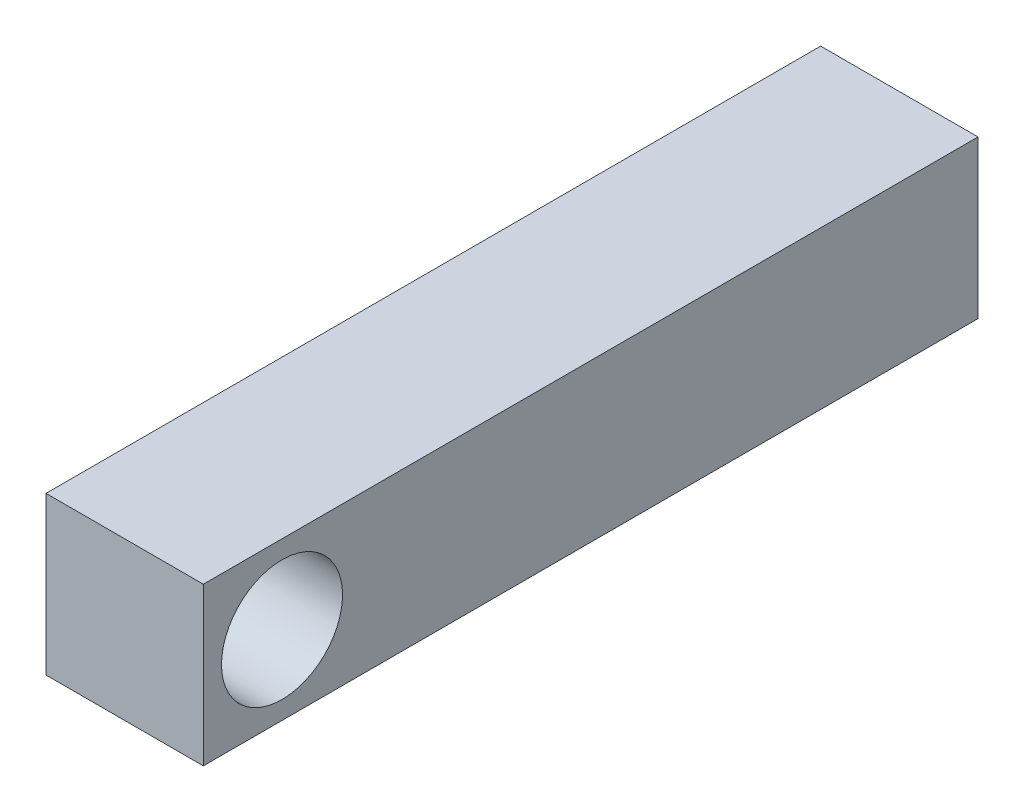
ISO-10303-21;
HEADER;
FILE_DESCRIPTION(('STEP AP214'),'2;1');
FILE_NAME('part.step','',(''),(''),'','','');
FILE_SCHEMA(('AUTOMOTIVE_DESIGN { 1 0 10303 214 1 1 1 1 }'));
ENDSEC;
DATA;
#1=APPLICATION_CONTEXT('core data for automotive mechanical design processes');
#2=APPLICATION_PROTOCOL_DEFINITION('international standard','automotive_design',2000,#1);
#3=PRODUCT_CONTEXT('',#1,'mechanical');
#4=PRODUCT('Part','Part','',(#3));
#5=PRODUCT_RELATED_PRODUCT_CATEGORY('part','',(#4));
#6=PRODUCT_DEFINITION_FORMATION('','',#4);
#7=PRODUCT_DEFINITION_CONTEXT('part definition',#1,'design');
#8=PRODUCT_DEFINITION('design','',#6,#7);
#9=PRODUCT_DEFINITION_SHAPE('','',#8);
#10=(LENGTH_UNIT() NAMED_UNIT(*) SI_UNIT(.MILLI.,.METRE.));
#11=(NAMED_UNIT(*) PLANE_ANGLE_UNIT() SI_UNIT($,.RADIAN.));
#12=(NAMED_UNIT(*) SI_UNIT($,.STERADIAN.) SOLID_ANGLE_UNIT());
#13=UNCERTAINTY_MEASURE_WITH_UNIT(LENGTH_MEASURE(1.E-05),#10,'distance_accuracy_value','');
#14=(GEOMETRIC_REPRESENTATION_CONTEXT(3) GLOBAL_UNCERTAINTY_ASSIGNED_CONTEXT((#13)) GLOBAL_UNIT_ASSIGNED_CONTEXT((#10,
#11,#12)) REPRESENTATION_CONTEXT('',''));
#15=CARTESIAN_POINT('',(0.,0.,0.));
#16=DIRECTION('',(0.,0.,1.));
#17=DIRECTION('',(1.,0.,0.));
#18=AXIS2_PLACEMENT_3D('',#15,#16,#17);
#19=CARTESIAN_POINT('',(-20.6375,-20.6375,203.2));
#20=DIRECTION('',(1.,0.,0.));
#21=DIRECTION('',(0.,0.,-1.));
#22=AXIS2_PLACEMENT_3D('',#19,#20,#21);
#23=PLANE('',#22);
#24=CARTESIAN_POINT('',(-20.6375,0.,182.5625));
#25=DIRECTION('',(-1.,0.,0.));
#26=DIRECTION('',(0.,0.,1.));
#27=AXIS2_PLACEMENT_3D('',#24,#25,#26);
#28=CIRCLE('',#27,15.875);
#29=CARTESIAN_POINT('',(-20.6375,0.,198.4375));
#30=VERTEX_POINT('',#29);
#31=EDGE_CURVE('E128',#30,#30,#28,.T.);
#32=ORIENTED_EDGE('',*,*,#31,.F.);
#33=EDGE_LOOP('',(#32));
#34=FACE_BOUND('',#33,.T.);
#35=DIRECTION('',(0.,-1.,0.));
#36=VECTOR('',#35,1.);
#37=CARTESIAN_POINT('',(-20.6375,-20.6375,0.));
#38=LINE('',#37,#36);
#39=CARTESIAN_POINT('',(-20.6375,20.6375,0.));
#40=VERTEX_POINT('',#39);
#41=CARTESIAN_POINT('',(-20.6375,-20.6375,0.));
#42=VERTEX_POINT('',#41);
#43=EDGE_CURVE('E104',#40,#42,#38,.T.);
#44=ORIENTED_EDGE('',*,*,#43,.T.);
#45=DIRECTION('',(0.,0.,-1.));
#46=VECTOR('',#45,1.);
#47=CARTESIAN_POINT('',(-20.6375,-20.6375,203.2));
#48=LINE('',#47,#46);
#49=CARTESIAN_POINT('',(-20.6375,-20.6375,203.2));
#50=VERTEX_POINT('',#49);
#51=EDGE_CURVE('E11',#50,#42,#48,.T.);
#52=ORIENTED_EDGE('',*,*,#51,.F.);
#53=DIRECTION('',(0.,-1.,0.));
#54=VECTOR('',#53,1.);
#55=CARTESIAN_POINT('',(-20.6375,-20.6375,203.2));
#56=LINE('',#55,#54);
#57=CARTESIAN_POINT('',(-20.6375,20.6375,203.2));
#58=VERTEX_POINT('',#57);
#59=EDGE_CURVE('E91',#58,#50,#56,.T.);
#60=ORIENTED_EDGE('',*,*,#59,.F.);
#61=DIRECTION('',(0.,0.,-1.));
#62=VECTOR('',#61,1.);
#63=CARTESIAN_POINT('',(-20.6375,20.6375,203.2));
#64=LINE('',#63,#62);
#65=EDGE_CURVE('E100',#58,#40,#64,.T.);
#66=ORIENTED_EDGE('',*,*,#65,.T.);
#67=EDGE_LOOP('',(#44,#52,#60,#66));
#68=FACE_BOUND('',#67,.T.);
#69=ADVANCED_FACE('F39',(#34,#68),#23,.F.);
#70=CARTESIAN_POINT('',(20.6375,-20.6375,203.2));
#71=DIRECTION('',(0.,1.,0.));
#72=DIRECTION('',(-1.,0.,0.));
#73=AXIS2_PLACEMENT_3D('',#70,#71,#72);
#74=PLANE('',#73);
#75=CARTESIAN_POINT('',(0.,-20.6375,20.6375));
#76=DIRECTION('',(0.,-1.,0.));
#77=DIRECTION('',(0.,0.,-1.));
#78=AXIS2_PLACEMENT_3D('',#75,#76,#77);
#79=CIRCLE('',#78,15.875);
#80=CARTESIAN_POINT('',(0.,-20.6375,4.7625));
#81=VERTEX_POINT('',#80);
#82=EDGE_CURVE('E120',#81,#81,#79,.T.);
#83=ORIENTED_EDGE('',*,*,#82,.F.);
#84=EDGE_LOOP('',(#83));
#85=FACE_BOUND('',#84,.T.);
#86=DIRECTION('',(1.,0.,0.));
#87=VECTOR('',#86,1.);
#88=CARTESIAN_POINT('',(20.6375,-20.6375,0.));
#89=LINE('',#88,#87);
#90=CARTESIAN_POINT('',(20.6375,-20.6375,0.));
#91=VERTEX_POINT('',#90);
#92=EDGE_CURVE('E95',#42,#91,#89,.T.);
#93=ORIENTED_EDGE('',*,*,#92,.T.);
#94=DIRECTION('',(0.,0.,-1.));
#95=VECTOR('',#94,1.);
#96=CARTESIAN_POINT('',(20.6375,-20.6375,203.2));
#97=LINE('',#96,#95);
#98=CARTESIAN_POINT('',(20.6375,-20.6375,203.2));
#99=VERTEX_POINT('',#98);
#100=EDGE_CURVE('E48',#99,#91,#97,.T.);
#101=ORIENTED_EDGE('',*,*,#100,.F.);
#102=DIRECTION('',(1.,0.,0.));
#103=VECTOR('',#102,1.);
#104=CARTESIAN_POINT('',(20.6375,-20.6375,203.2));
#105=LINE('',#104,#103);
#106=EDGE_CURVE('E86',#50,#99,#105,.T.);
#107=ORIENTED_EDGE('',*,*,#106,.F.);
#108=ORIENTED_EDGE('',*,*,#51,.T.);
#109=EDGE_LOOP('',(#93,#101,#107,#108));
#110=FACE_BOUND('',#109,.T.);
#111=ADVANCED_FACE('F94',(#85,#110),#74,.F.);
#112=CARTESIAN_POINT('',(20.6375,-20.6375,203.2));
#113=DIRECTION('',(-1.,0.,0.));
#114=DIRECTION('',(0.,0.,1.));
#115=AXIS2_PLACEMENT_3D('',#112,#113,#114);
#116=PLANE('',#115);
#117=CARTESIAN_POINT('',(20.6375,0.,182.5625));
#118=DIRECTION('',(-1.,0.,0.));
#119=DIRECTION('',(0.,0.,1.));
#120=AXIS2_PLACEMENT_3D('',#117,#118,#119);
#121=CIRCLE('',#120,15.875);
#122=CARTESIAN_POINT('',(20.6375,0.,198.4375));
#123=VERTEX_POINT('',#122);
#124=EDGE_CURVE('E124',#123,#123,#121,.T.);
#125=ORIENTED_EDGE('',*,*,#124,.T.);
#126=EDGE_LOOP('',(#125));
#127=FACE_BOUND('',#126,.T.);
#128=DIRECTION('',(0.,1.,0.));
#129=VECTOR('',#128,1.);
#130=CARTESIAN_POINT('',(20.6375,-20.6375,0.));
#131=LINE('',#130,#129);
#132=CARTESIAN_POINT('',(20.6375,20.6375,0.));
#133=VERTEX_POINT('',#132);
#134=EDGE_CURVE('E73',#91,#133,#131,.T.);
#135=ORIENTED_EDGE('',*,*,#134,.T.);
#136=DIRECTION('',(0.,0.,-1.));
#137=VECTOR('',#136,1.);
#138=CARTESIAN_POINT('',(20.6375,20.6375,203.2));
#139=LINE('',#138,#137);
#140=CARTESIAN_POINT('',(20.6375,20.6375,203.2));
#141=VERTEX_POINT('',#140);
#142=EDGE_CURVE('E97',#141,#133,#139,.T.);
#143=ORIENTED_EDGE('',*,*,#142,.F.);
#144=DIRECTION('',(0.,1.,0.));
#145=VECTOR('',#144,1.);
#146=CARTESIAN_POINT('',(20.6375,-20.6375,203.2));
#147=LINE('',#146,#145);
#148=EDGE_CURVE('E89',#99,#141,#147,.T.);
#149=ORIENTED_EDGE('',*,*,#148,.F.);
#150=ORIENTED_EDGE('',*,*,#100,.T.);
#151=EDGE_LOOP('',(#135,#143,#149,#150));
#152=FACE_BOUND('',#151,.T.);
#153=ADVANCED_FACE('F98',(#127,#152),#116,.F.);
#154=CARTESIAN_POINT('',(20.6375,20.6375,203.2));
#155=DIRECTION('',(0.,-1.,0.));
#156=DIRECTION('',(1.,0.,0.));
#157=AXIS2_PLACEMENT_3D('',#154,#155,#156);
#158=PLANE('',#157);
#159=DIRECTION('',(-1.,0.,0.));
#160=VECTOR('',#159,1.);
#161=CARTESIAN_POINT('',(20.6375,20.6375,0.));
#162=LINE('',#161,#160);
#163=EDGE_CURVE('E79',#133,#40,#162,.T.);
#164=ORIENTED_EDGE('',*,*,#163,.T.);
#165=ORIENTED_EDGE('',*,*,#65,.F.);
#166=DIRECTION('',(-1.,0.,0.));
#167=VECTOR('',#166,1.);
#168=CARTESIAN_POINT('',(20.6375,20.6375,203.2));
#169=LINE('',#168,#167);
#170=EDGE_CURVE('E56',#141,#58,#169,.T.);
#171=ORIENTED_EDGE('',*,*,#170,.F.);
#172=ORIENTED_EDGE('',*,*,#142,.T.);
#173=EDGE_LOOP('',(#164,#165,#171,#172));
#174=FACE_BOUND('',#173,.T.);
#175=ADVANCED_FACE('F114',(#174),#158,.F.);
#176=CARTESIAN_POINT('',(0.,0.,203.2));
#177=DIRECTION('',(0.,0.,1.));
#178=DIRECTION('',(1.,0.,0.));
#179=AXIS2_PLACEMENT_3D('',#176,#177,#178);
#180=PLANE('',#179);
#181=ORIENTED_EDGE('',*,*,#59,.T.);
#182=ORIENTED_EDGE('',*,*,#106,.T.);
#183=ORIENTED_EDGE('',*,*,#148,.T.);
#184=ORIENTED_EDGE('',*,*,#170,.T.);
#185=EDGE_LOOP('',(#181,#182,#183,#184));
#186=FACE_BOUND('',#185,.T.);
#187=ADVANCED_FACE('F87',(#186),#180,.T.);
#188=CARTESIAN_POINT('',(0.,0.,0.));
#189=DIRECTION('',(0.,0.,1.));
#190=DIRECTION('',(1.,0.,0.));
#191=AXIS2_PLACEMENT_3D('',#188,#189,#190);
#192=PLANE('',#191);
#193=ORIENTED_EDGE('',*,*,#43,.F.);
#194=ORIENTED_EDGE('',*,*,#163,.F.);
#195=ORIENTED_EDGE('',*,*,#134,.F.);
#196=ORIENTED_EDGE('',*,*,#92,.F.);
#197=EDGE_LOOP('',(#193,#194,#195,#196));
#198=FACE_BOUND('',#197,.T.);
#199=ADVANCED_FACE('F117',(#198),#192,.F.);
#200=CARTESIAN_POINT('',(0.,11.1125,20.6375));
#201=DIRECTION('',(0.,-1.,0.));
#202=DIRECTION('',(0.,0.,-1.));
#203=AXIS2_PLACEMENT_3D('',#200,#201,#202);
#204=CYLINDRICAL_SURFACE('',#203,15.875);
#205=CARTESIAN_POINT('',(0.,11.1125,20.6375));
#206=DIRECTION('',(0.,-1.,0.));
#207=DIRECTION('',(0.,0.,-1.));
#208=AXIS2_PLACEMENT_3D('',#205,#206,#207);
#209=CIRCLE('',#208,15.875);
#210=CARTESIAN_POINT('',(0.,11.1125,4.7625));
#211=VERTEX_POINT('',#210);
#212=EDGE_CURVE('E107',#211,#211,#209,.T.);
#213=ORIENTED_EDGE('',*,*,#212,.F.);
#214=EDGE_LOOP('',(#213));
#215=FACE_BOUND('',#214,.T.);
#216=ORIENTED_EDGE('',*,*,#82,.T.);
#217=EDGE_LOOP('',(#216));
#218=FACE_BOUND('',#217,.T.);
#219=ADVANCED_FACE('F157',(#215,#218),#204,.F.);
#220=CARTESIAN_POINT('',(0.,11.1125,20.6375));
#221=DIRECTION('',(0.,-1.,0.));
#222=DIRECTION('',(0.,0.,-1.));
#223=AXIS2_PLACEMENT_3D('',#220,#221,#222);
#224=PLANE('',#223);
#225=ORIENTED_EDGE('',*,*,#212,.T.);
#226=EDGE_LOOP('',(#225));
#227=FACE_BOUND('',#226,.T.);
#228=ADVANCED_FACE('F138',(#227),#224,.T.);
#229=CARTESIAN_POINT('',(20.6375,0.,182.5625));
#230=DIRECTION('',(-1.,0.,0.));
#231=DIRECTION('',(0.,0.,1.));
#232=AXIS2_PLACEMENT_3D('',#229,#230,#231);
#233=CYLINDRICAL_SURFACE('',#232,15.875);
#234=ORIENTED_EDGE('',*,*,#124,.F.);
#235=EDGE_LOOP('',(#234));
#236=FACE_BOUND('',#235,.T.);
#237=ORIENTED_EDGE('',*,*,#31,.T.);
#238=EDGE_LOOP('',(#237));
#239=FACE_BOUND('',#238,.T.);
#240=ADVANCED_FACE('F135',(#236,#239),#233,.F.);
#241=CLOSED_SHELL('',(#69,#111,#153,#175,#187,#199,#219,#228,#240));
#242=MANIFOLD_SOLID_BREP('B2',#241);
#243=ADVANCED_BREP_SHAPE_REPRESENTATION('',(#18,#242),#14);
#244=SHAPE_DEFINITION_REPRESENTATION(#9,#243);
ENDSEC;
END-ISO-10303-21;
